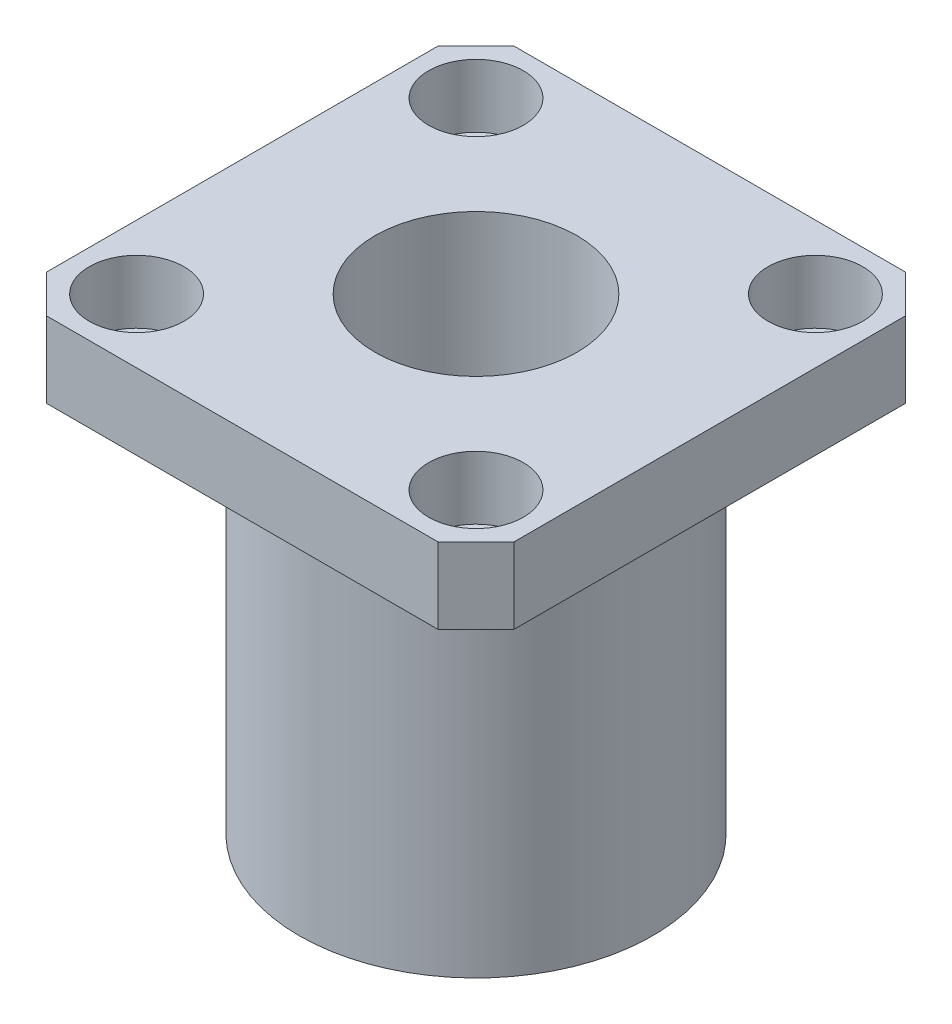
ISO-10303-21;
HEADER;
FILE_DESCRIPTION(('STEP AP214'),'2;1');
FILE_NAME('part.step','',(''),(''),'','','');
FILE_SCHEMA(('AUTOMOTIVE_DESIGN { 1 0 10303 214 1 1 1 1 }'));
ENDSEC;
DATA;
#1=APPLICATION_CONTEXT('core data for automotive mechanical design processes');
#2=APPLICATION_PROTOCOL_DEFINITION('international standard','automotive_design',2000,#1);
#3=PRODUCT_CONTEXT('',#1,'mechanical');
#4=PRODUCT('Part','Part','',(#3));
#5=PRODUCT_RELATED_PRODUCT_CATEGORY('part','',(#4));
#6=PRODUCT_DEFINITION_FORMATION('','',#4);
#7=PRODUCT_DEFINITION_CONTEXT('part definition',#1,'design');
#8=PRODUCT_DEFINITION('design','',#6,#7);
#9=PRODUCT_DEFINITION_SHAPE('','',#8);
#10=(LENGTH_UNIT() NAMED_UNIT(*) SI_UNIT(.MILLI.,.METRE.));
#11=(NAMED_UNIT(*) PLANE_ANGLE_UNIT() SI_UNIT($,.RADIAN.));
#12=(NAMED_UNIT(*) SI_UNIT($,.STERADIAN.) SOLID_ANGLE_UNIT());
#13=UNCERTAINTY_MEASURE_WITH_UNIT(LENGTH_MEASURE(1.E-05),#10,'distance_accuracy_value','');
#14=(GEOMETRIC_REPRESENTATION_CONTEXT(3) GLOBAL_UNCERTAINTY_ASSIGNED_CONTEXT((#13)) GLOBAL_UNIT_ASSIGNED_CONTEXT((#10,
#11,#12)) REPRESENTATION_CONTEXT('',''));
#15=CARTESIAN_POINT('',(0.,0.,0.));
#16=DIRECTION('',(0.,0.,1.));
#17=DIRECTION('',(1.,0.,0.));
#18=AXIS2_PLACEMENT_3D('',#15,#16,#17);
#19=CARTESIAN_POINT('',(0.,37.,0.));
#20=DIRECTION('',(0.,-1.,0.));
#21=DIRECTION('',(0.,0.,-1.));
#22=AXIS2_PLACEMENT_3D('',#19,#20,#21);
#23=CYLINDRICAL_SURFACE('',#22,14.);
#24=CARTESIAN_POINT('',(0.,0.,0.));
#25=DIRECTION('',(0.,1.,0.));
#26=DIRECTION('',(0.,0.,1.));
#27=AXIS2_PLACEMENT_3D('',#24,#25,#26);
#28=CIRCLE('',#27,14.);
#29=CARTESIAN_POINT('',(0.,0.,14.));
#30=VERTEX_POINT('',#29);
#31=EDGE_CURVE('E123',#30,#30,#28,.T.);
#32=ORIENTED_EDGE('',*,*,#31,.T.);
#33=EDGE_LOOP('',(#32));
#34=FACE_BOUND('',#33,.T.);
#35=CARTESIAN_POINT('',(0.,31.,0.));
#36=DIRECTION('',(0.,1.,0.));
#37=DIRECTION('',(0.,0.,1.));
#38=AXIS2_PLACEMENT_3D('',#35,#36,#37);
#39=CIRCLE('',#38,14.);
#40=CARTESIAN_POINT('',(0.,31.,14.));
#41=VERTEX_POINT('',#40);
#42=EDGE_CURVE('E119',#41,#41,#39,.T.);
#43=ORIENTED_EDGE('',*,*,#42,.F.);
#44=EDGE_LOOP('',(#43));
#45=FACE_BOUND('',#44,.T.);
#46=ADVANCED_FACE('F34',(#34,#45),#23,.T.);
#47=CARTESIAN_POINT('',(0.,37.,0.));
#48=DIRECTION('',(0.,1.,0.));
#49=DIRECTION('',(0.,0.,1.));
#50=AXIS2_PLACEMENT_3D('',#47,#48,#49);
#51=PLANE('',#50);
#52=CARTESIAN_POINT('',(13.4350288425444,37.,13.4350288425444));
#53=DIRECTION('',(0.,1.,0.));
#54=DIRECTION('',(0.,0.,1.));
#55=AXIS2_PLACEMENT_3D('',#52,#53,#54);
#56=CIRCLE('',#55,3.75);
#57=CARTESIAN_POINT('',(13.4350288425444,37.,17.1850288425444));
#58=VERTEX_POINT('',#57);
#59=EDGE_CURVE('E302',#58,#58,#56,.T.);
#60=ORIENTED_EDGE('',*,*,#59,.F.);
#61=EDGE_LOOP('',(#60));
#62=FACE_BOUND('',#61,.T.);
#63=CARTESIAN_POINT('',(-13.4350288425444,37.,13.4350288425444));
#64=DIRECTION('',(0.,1.,0.));
#65=DIRECTION('',(0.,0.,1.));
#66=AXIS2_PLACEMENT_3D('',#63,#64,#65);
#67=CIRCLE('',#66,3.75);
#68=CARTESIAN_POINT('',(-13.4350288425444,37.,17.1850288425444));
#69=VERTEX_POINT('',#68);
#70=EDGE_CURVE('E312',#69,#69,#67,.T.);
#71=ORIENTED_EDGE('',*,*,#70,.F.);
#72=EDGE_LOOP('',(#71));
#73=FACE_BOUND('',#72,.T.);
#74=CARTESIAN_POINT('',(-13.4350288425444,37.,-13.4350288425444));
#75=DIRECTION('',(0.,1.,0.));
#76=DIRECTION('',(0.,0.,1.));
#77=AXIS2_PLACEMENT_3D('',#74,#75,#76);
#78=CIRCLE('',#77,3.75);
#79=CARTESIAN_POINT('',(-13.4350288425444,37.,-9.6850288425444));
#80=VERTEX_POINT('',#79);
#81=EDGE_CURVE('E324',#80,#80,#78,.T.);
#82=ORIENTED_EDGE('',*,*,#81,.F.);
#83=EDGE_LOOP('',(#82));
#84=FACE_BOUND('',#83,.T.);
#85=CARTESIAN_POINT('',(13.4350288425444,37.,-13.4350288425444));
#86=DIRECTION('',(0.,1.,0.));
#87=DIRECTION('',(0.,0.,1.));
#88=AXIS2_PLACEMENT_3D('',#85,#86,#87);
#89=CIRCLE('',#88,3.75);
#90=CARTESIAN_POINT('',(13.4350288425444,37.,-9.6850288425444));
#91=VERTEX_POINT('',#90);
#92=EDGE_CURVE('E336',#91,#91,#89,.T.);
#93=ORIENTED_EDGE('',*,*,#92,.F.);
#94=EDGE_LOOP('',(#93));
#95=FACE_BOUND('',#94,.T.);
#96=CARTESIAN_POINT('',(0.,37.,0.));
#97=DIRECTION('',(0.,1.,0.));
#98=DIRECTION('',(0.,0.,1.));
#99=AXIS2_PLACEMENT_3D('',#96,#97,#98);
#100=CIRCLE('',#99,8.);
#101=CARTESIAN_POINT('',(0.,37.,8.));
#102=VERTEX_POINT('',#101);
#103=EDGE_CURVE('E171',#102,#102,#100,.T.);
#104=ORIENTED_EDGE('',*,*,#103,.F.);
#105=EDGE_LOOP('',(#104));
#106=FACE_BOUND('',#105,.T.);
#107=DIRECTION('',(0.,0.,-1.));
#108=VECTOR('',#107,1.);
#109=CARTESIAN_POINT('',(18.5,37.,18.5));
#110=LINE('',#109,#108);
#111=CARTESIAN_POINT('',(18.5,37.,15.5));
#112=VERTEX_POINT('',#111);
#113=CARTESIAN_POINT('',(18.5,37.,-15.5));
#114=VERTEX_POINT('',#113);
#115=EDGE_CURVE('E102',#112,#114,#110,.T.);
#116=ORIENTED_EDGE('',*,*,#115,.T.);
#117=DIRECTION('',(0.707106781186548,0.,0.707106781186547));
#118=VECTOR('',#117,1.);
#119=CARTESIAN_POINT('',(17.,37.,-17.));
#120=LINE('',#119,#118);
#121=CARTESIAN_POINT('',(15.5,37.,-18.5));
#122=VERTEX_POINT('',#121);
#123=EDGE_CURVE('E131',#114,#122,#120,.F.);
#124=ORIENTED_EDGE('',*,*,#123,.T.);
#125=DIRECTION('',(-1.,0.,0.));
#126=VECTOR('',#125,1.);
#127=CARTESIAN_POINT('',(18.5,37.,-18.5));
#128=LINE('',#127,#126);
#129=CARTESIAN_POINT('',(-15.5,37.,-18.5));
#130=VERTEX_POINT('',#129);
#131=EDGE_CURVE('E117',#122,#130,#128,.T.);
#132=ORIENTED_EDGE('',*,*,#131,.T.);
#133=DIRECTION('',(0.707106781186548,0.,-0.707106781186548));
#134=VECTOR('',#133,1.);
#135=CARTESIAN_POINT('',(-17.,37.,-17.));
#136=LINE('',#135,#134);
#137=CARTESIAN_POINT('',(-18.5,37.,-15.5));
#138=VERTEX_POINT('',#137);
#139=EDGE_CURVE('E129',#130,#138,#136,.F.);
#140=ORIENTED_EDGE('',*,*,#139,.T.);
#141=DIRECTION('',(0.,0.,1.));
#142=VECTOR('',#141,1.);
#143=CARTESIAN_POINT('',(-18.5,37.,18.5));
#144=LINE('',#143,#142);
#145=CARTESIAN_POINT('',(-18.5,37.,15.5));
#146=VERTEX_POINT('',#145);
#147=EDGE_CURVE('E164',#138,#146,#144,.T.);
#148=ORIENTED_EDGE('',*,*,#147,.T.);
#149=DIRECTION('',(-0.707106781186548,0.,-0.707106781186547));
#150=VECTOR('',#149,1.);
#151=CARTESIAN_POINT('',(-17.,37.,17.));
#152=LINE('',#151,#150);
#153=CARTESIAN_POINT('',(-15.5,37.,18.5));
#154=VERTEX_POINT('',#153);
#155=EDGE_CURVE('E108',#146,#154,#152,.F.);
#156=ORIENTED_EDGE('',*,*,#155,.T.);
#157=DIRECTION('',(1.,0.,0.));
#158=VECTOR('',#157,1.);
#159=CARTESIAN_POINT('',(18.5,37.,18.5));
#160=LINE('',#159,#158);
#161=CARTESIAN_POINT('',(15.5,37.,18.5));
#162=VERTEX_POINT('',#161);
#163=EDGE_CURVE('E103',#154,#162,#160,.T.);
#164=ORIENTED_EDGE('',*,*,#163,.T.);
#165=DIRECTION('',(-0.707106781186547,0.,0.707106781186548));
#166=VECTOR('',#165,1.);
#167=CARTESIAN_POINT('',(17.,37.,17.));
#168=LINE('',#167,#166);
#169=EDGE_CURVE('E99',#162,#112,#168,.F.);
#170=ORIENTED_EDGE('',*,*,#169,.T.);
#171=EDGE_LOOP('',(#116,#124,#132,#140,#148,#156,#164,#170));
#172=FACE_BOUND('',#171,.T.);
#173=ADVANCED_FACE('F101',(#62,#73,#84,#95,#106,#172),#51,.T.);
#174=CARTESIAN_POINT('',(0.,0.,0.));
#175=DIRECTION('',(0.,1.,0.));
#176=DIRECTION('',(0.,0.,1.));
#177=AXIS2_PLACEMENT_3D('',#174,#175,#176);
#178=PLANE('',#177);
#179=ORIENTED_EDGE('',*,*,#31,.F.);
#180=EDGE_LOOP('',(#179));
#181=FACE_BOUND('',#180,.T.);
#182=CARTESIAN_POINT('',(0.,0.,0.));
#183=DIRECTION('',(0.,1.,0.));
#184=DIRECTION('',(0.,0.,1.));
#185=AXIS2_PLACEMENT_3D('',#182,#183,#184);
#186=CIRCLE('',#185,8.);
#187=CARTESIAN_POINT('',(0.,0.,8.));
#188=VERTEX_POINT('',#187);
#189=EDGE_CURVE('E163',#188,#188,#186,.T.);
#190=ORIENTED_EDGE('',*,*,#189,.T.);
#191=EDGE_LOOP('',(#190));
#192=FACE_BOUND('',#191,.T.);
#193=ADVANCED_FACE('F176',(#181,#192),#178,.F.);
#194=CARTESIAN_POINT('',(0.,37.,0.));
#195=DIRECTION('',(0.,-1.,0.));
#196=DIRECTION('',(0.,0.,-1.));
#197=AXIS2_PLACEMENT_3D('',#194,#195,#196);
#198=CYLINDRICAL_SURFACE('',#197,8.);
#199=ORIENTED_EDGE('',*,*,#103,.T.);
#200=EDGE_LOOP('',(#199));
#201=FACE_BOUND('',#200,.T.);
#202=ORIENTED_EDGE('',*,*,#189,.F.);
#203=EDGE_LOOP('',(#202));
#204=FACE_BOUND('',#203,.T.);
#205=ADVANCED_FACE('F178',(#201,#204),#198,.F.);
#206=CARTESIAN_POINT('',(0.,31.,0.));
#207=DIRECTION('',(0.,1.,0.));
#208=DIRECTION('',(0.,0.,1.));
#209=AXIS2_PLACEMENT_3D('',#206,#207,#208);
#210=PLANE('',#209);
#211=CARTESIAN_POINT('',(13.4350288425444,31.,13.4350288425444));
#212=DIRECTION('',(0.,1.,0.));
#213=DIRECTION('',(0.,0.,1.));
#214=AXIS2_PLACEMENT_3D('',#211,#212,#213);
#215=CIRCLE('',#214,2.25);
#216=CARTESIAN_POINT('',(13.4350288425444,31.,15.6850288425444));
#217=VERTEX_POINT('',#216);
#218=EDGE_CURVE('E309',#217,#217,#215,.T.);
#219=ORIENTED_EDGE('',*,*,#218,.T.);
#220=EDGE_LOOP('',(#219));
#221=FACE_BOUND('',#220,.T.);
#222=CARTESIAN_POINT('',(-13.4350288425444,31.,13.4350288425444));
#223=DIRECTION('',(0.,1.,0.));
#224=DIRECTION('',(0.,0.,1.));
#225=AXIS2_PLACEMENT_3D('',#222,#223,#224);
#226=CIRCLE('',#225,2.25);
#227=CARTESIAN_POINT('',(-13.4350288425444,31.,15.6850288425444));
#228=VERTEX_POINT('',#227);
#229=EDGE_CURVE('E321',#228,#228,#226,.T.);
#230=ORIENTED_EDGE('',*,*,#229,.T.);
#231=EDGE_LOOP('',(#230));
#232=FACE_BOUND('',#231,.T.);
#233=CARTESIAN_POINT('',(-13.4350288425444,31.,-13.4350288425444));
#234=DIRECTION('',(0.,1.,0.));
#235=DIRECTION('',(0.,0.,1.));
#236=AXIS2_PLACEMENT_3D('',#233,#234,#235);
#237=CIRCLE('',#236,2.25);
#238=CARTESIAN_POINT('',(-13.4350288425444,31.,-11.1850288425444));
#239=VERTEX_POINT('',#238);
#240=EDGE_CURVE('E333',#239,#239,#237,.T.);
#241=ORIENTED_EDGE('',*,*,#240,.T.);
#242=EDGE_LOOP('',(#241));
#243=FACE_BOUND('',#242,.T.);
#244=CARTESIAN_POINT('',(13.4350288425444,31.,-13.4350288425444));
#245=DIRECTION('',(0.,1.,0.));
#246=DIRECTION('',(0.,0.,1.));
#247=AXIS2_PLACEMENT_3D('',#244,#245,#246);
#248=CIRCLE('',#247,2.25);
#249=CARTESIAN_POINT('',(13.4350288425444,31.,-11.1850288425444));
#250=VERTEX_POINT('',#249);
#251=EDGE_CURVE('E167',#250,#250,#248,.T.);
#252=ORIENTED_EDGE('',*,*,#251,.T.);
#253=EDGE_LOOP('',(#252));
#254=FACE_BOUND('',#253,.T.);
#255=DIRECTION('',(-1.,0.,0.));
#256=VECTOR('',#255,1.);
#257=CARTESIAN_POINT('',(18.5,31.,-18.5));
#258=LINE('',#257,#256);
#259=CARTESIAN_POINT('',(15.5,31.,-18.5));
#260=VERTEX_POINT('',#259);
#261=CARTESIAN_POINT('',(-15.5,31.,-18.5));
#262=VERTEX_POINT('',#261);
#263=EDGE_CURVE('E155',#260,#262,#258,.T.);
#264=ORIENTED_EDGE('',*,*,#263,.F.);
#265=DIRECTION('',(-0.707106781186548,0.,-0.707106781186547));
#266=VECTOR('',#265,1.);
#267=CARTESIAN_POINT('',(18.5,31.,-15.5));
#268=LINE('',#267,#266);
#269=CARTESIAN_POINT('',(18.5,31.,-15.5));
#270=VERTEX_POINT('',#269);
#271=EDGE_CURVE('E143',#260,#270,#268,.F.);
#272=ORIENTED_EDGE('',*,*,#271,.T.);
#273=DIRECTION('',(0.,0.,-1.));
#274=VECTOR('',#273,1.);
#275=CARTESIAN_POINT('',(18.5,31.,18.5));
#276=LINE('',#275,#274);
#277=CARTESIAN_POINT('',(18.5,31.,15.5));
#278=VERTEX_POINT('',#277);
#279=EDGE_CURVE('E152',#278,#270,#276,.T.);
#280=ORIENTED_EDGE('',*,*,#279,.F.);
#281=DIRECTION('',(0.707106781186547,0.,-0.707106781186548));
#282=VECTOR('',#281,1.);
#283=CARTESIAN_POINT('',(15.5,31.,18.5));
#284=LINE('',#283,#282);
#285=CARTESIAN_POINT('',(15.5,31.,18.5));
#286=VERTEX_POINT('',#285);
#287=EDGE_CURVE('E49',#278,#286,#284,.F.);
#288=ORIENTED_EDGE('',*,*,#287,.T.);
#289=DIRECTION('',(1.,0.,0.));
#290=VECTOR('',#289,1.);
#291=CARTESIAN_POINT('',(18.5,31.,18.5));
#292=LINE('',#291,#290);
#293=CARTESIAN_POINT('',(-15.5,31.,18.5));
#294=VERTEX_POINT('',#293);
#295=EDGE_CURVE('E150',#294,#286,#292,.T.);
#296=ORIENTED_EDGE('',*,*,#295,.F.);
#297=DIRECTION('',(0.707106781186548,0.,0.707106781186547));
#298=VECTOR('',#297,1.);
#299=CARTESIAN_POINT('',(-18.5,31.,15.5));
#300=LINE('',#299,#298);
#301=CARTESIAN_POINT('',(-18.5,31.,15.5));
#302=VERTEX_POINT('',#301);
#303=EDGE_CURVE('E139',#294,#302,#300,.F.);
#304=ORIENTED_EDGE('',*,*,#303,.T.);
#305=DIRECTION('',(0.,0.,1.));
#306=VECTOR('',#305,1.);
#307=CARTESIAN_POINT('',(-18.5,31.,18.5));
#308=LINE('',#307,#306);
#309=CARTESIAN_POINT('',(-18.5,31.,-15.5));
#310=VERTEX_POINT('',#309);
#311=EDGE_CURVE('E153',#310,#302,#308,.T.);
#312=ORIENTED_EDGE('',*,*,#311,.F.);
#313=DIRECTION('',(-0.707106781186548,0.,0.707106781186548));
#314=VECTOR('',#313,1.);
#315=CARTESIAN_POINT('',(-15.5,31.,-18.5));
#316=LINE('',#315,#314);
#317=EDGE_CURVE('E141',#310,#262,#316,.F.);
#318=ORIENTED_EDGE('',*,*,#317,.T.);
#319=EDGE_LOOP('',(#264,#272,#280,#288,#296,#304,#312,#318));
#320=FACE_BOUND('',#319,.T.);
#321=ORIENTED_EDGE('',*,*,#42,.T.);
#322=EDGE_LOOP('',(#321));
#323=FACE_BOUND('',#322,.T.);
#324=ADVANCED_FACE('F180',(#221,#232,#243,#254,#320,#323),#210,.F.);
#325=CARTESIAN_POINT('',(-18.5,31.,18.5));
#326=DIRECTION('',(-1.,0.,0.));
#327=DIRECTION('',(0.,0.,1.));
#328=AXIS2_PLACEMENT_3D('',#325,#326,#327);
#329=PLANE('',#328);
#330=ORIENTED_EDGE('',*,*,#147,.F.);
#331=DIRECTION('',(0.,-1.,0.));
#332=VECTOR('',#331,1.);
#333=CARTESIAN_POINT('',(-18.5,31.,-15.5));
#334=LINE('',#333,#332);
#335=EDGE_CURVE('E148',#138,#310,#334,.T.);
#336=ORIENTED_EDGE('',*,*,#335,.T.);
#337=ORIENTED_EDGE('',*,*,#311,.T.);
#338=DIRECTION('',(0.,1.,0.));
#339=VECTOR('',#338,1.);
#340=CARTESIAN_POINT('',(-18.5,31.,15.5));
#341=LINE('',#340,#339);
#342=EDGE_CURVE('E145',#302,#146,#341,.T.);
#343=ORIENTED_EDGE('',*,*,#342,.T.);
#344=EDGE_LOOP('',(#330,#336,#337,#343));
#345=FACE_BOUND('',#344,.T.);
#346=ADVANCED_FACE('F187',(#345),#329,.T.);
#347=CARTESIAN_POINT('',(18.5,31.,-18.5));
#348=DIRECTION('',(0.,0.,-1.));
#349=DIRECTION('',(-1.,0.,0.));
#350=AXIS2_PLACEMENT_3D('',#347,#348,#349);
#351=PLANE('',#350);
#352=ORIENTED_EDGE('',*,*,#131,.F.);
#353=DIRECTION('',(0.,-1.,0.));
#354=VECTOR('',#353,1.);
#355=CARTESIAN_POINT('',(15.5,31.,-18.5));
#356=LINE('',#355,#354);
#357=EDGE_CURVE('E136',#122,#260,#356,.T.);
#358=ORIENTED_EDGE('',*,*,#357,.T.);
#359=ORIENTED_EDGE('',*,*,#263,.T.);
#360=DIRECTION('',(0.,1.,0.));
#361=VECTOR('',#360,1.);
#362=CARTESIAN_POINT('',(-15.5,31.,-18.5));
#363=LINE('',#362,#361);
#364=EDGE_CURVE('E133',#262,#130,#363,.T.);
#365=ORIENTED_EDGE('',*,*,#364,.T.);
#366=EDGE_LOOP('',(#352,#358,#359,#365));
#367=FACE_BOUND('',#366,.T.);
#368=ADVANCED_FACE('F230',(#367),#351,.T.);
#369=CARTESIAN_POINT('',(18.5,31.,18.5));
#370=DIRECTION('',(1.,0.,0.));
#371=DIRECTION('',(0.,0.,-1.));
#372=AXIS2_PLACEMENT_3D('',#369,#370,#371);
#373=PLANE('',#372);
#374=ORIENTED_EDGE('',*,*,#279,.T.);
#375=DIRECTION('',(0.,1.,0.));
#376=VECTOR('',#375,1.);
#377=CARTESIAN_POINT('',(18.5,31.,-15.5));
#378=LINE('',#377,#376);
#379=EDGE_CURVE('E109',#270,#114,#378,.T.);
#380=ORIENTED_EDGE('',*,*,#379,.T.);
#381=ORIENTED_EDGE('',*,*,#115,.F.);
#382=DIRECTION('',(0.,-1.,0.));
#383=VECTOR('',#382,1.);
#384=CARTESIAN_POINT('',(18.5,31.,15.5));
#385=LINE('',#384,#383);
#386=EDGE_CURVE('E115',#112,#278,#385,.T.);
#387=ORIENTED_EDGE('',*,*,#386,.T.);
#388=EDGE_LOOP('',(#374,#380,#381,#387));
#389=FACE_BOUND('',#388,.T.);
#390=ADVANCED_FACE('F114',(#389),#373,.T.);
#391=CARTESIAN_POINT('',(18.5,31.,18.5));
#392=DIRECTION('',(0.,0.,1.));
#393=DIRECTION('',(1.,0.,0.));
#394=AXIS2_PLACEMENT_3D('',#391,#392,#393);
#395=PLANE('',#394);
#396=ORIENTED_EDGE('',*,*,#163,.F.);
#397=DIRECTION('',(0.,-1.,0.));
#398=VECTOR('',#397,1.);
#399=CARTESIAN_POINT('',(-15.5,31.,18.5));
#400=LINE('',#399,#398);
#401=EDGE_CURVE('E11',#154,#294,#400,.T.);
#402=ORIENTED_EDGE('',*,*,#401,.T.);
#403=ORIENTED_EDGE('',*,*,#295,.T.);
#404=DIRECTION('',(0.,1.,0.));
#405=VECTOR('',#404,1.);
#406=CARTESIAN_POINT('',(15.5,31.,18.5));
#407=LINE('',#406,#405);
#408=EDGE_CURVE('E42',#286,#162,#407,.T.);
#409=ORIENTED_EDGE('',*,*,#408,.T.);
#410=EDGE_LOOP('',(#396,#402,#403,#409));
#411=FACE_BOUND('',#410,.T.);
#412=ADVANCED_FACE('F149',(#411),#395,.T.);
#413=CARTESIAN_POINT('',(13.4350288425444,37.,-13.4350288425444));
#414=DIRECTION('',(0.,1.,0.));
#415=DIRECTION('',(0.,0.,1.));
#416=AXIS2_PLACEMENT_3D('',#413,#414,#415);
#417=CYLINDRICAL_SURFACE('',#416,2.25);
#418=ORIENTED_EDGE('',*,*,#251,.F.);
#419=EDGE_LOOP('',(#418));
#420=FACE_BOUND('',#419,.T.);
#421=CARTESIAN_POINT('',(13.4350288425444,32.,-13.4350288425444));
#422=DIRECTION('',(0.,1.,0.));
#423=DIRECTION('',(0.,0.,1.));
#424=AXIS2_PLACEMENT_3D('',#421,#422,#423);
#425=CIRCLE('',#424,2.25);
#426=CARTESIAN_POINT('',(13.4350288425444,32.,-11.1850288425444));
#427=VERTEX_POINT('',#426);
#428=EDGE_CURVE('E342',#427,#427,#425,.T.);
#429=ORIENTED_EDGE('',*,*,#428,.T.);
#430=EDGE_LOOP('',(#429));
#431=FACE_BOUND('',#430,.T.);
#432=ADVANCED_FACE('F242',(#420,#431),#417,.F.);
#433=CARTESIAN_POINT('',(15.6850288425444,32.,-13.4350288425444));
#434=DIRECTION('',(0.,-1.,0.));
#435=DIRECTION('',(0.,0.,-1.));
#436=AXIS2_PLACEMENT_3D('',#433,#434,#435);
#437=PLANE('',#436);
#438=ORIENTED_EDGE('',*,*,#428,.F.);
#439=EDGE_LOOP('',(#438));
#440=FACE_BOUND('',#439,.T.);
#441=CARTESIAN_POINT('',(13.4350288425444,32.,-13.4350288425444));
#442=DIRECTION('',(0.,1.,0.));
#443=DIRECTION('',(0.,0.,1.));
#444=AXIS2_PLACEMENT_3D('',#441,#442,#443);
#445=CIRCLE('',#444,3.75);
#446=CARTESIAN_POINT('',(13.4350288425444,32.,-9.6850288425444));
#447=VERTEX_POINT('',#446);
#448=EDGE_CURVE('E339',#447,#447,#445,.T.);
#449=ORIENTED_EDGE('',*,*,#448,.T.);
#450=EDGE_LOOP('',(#449));
#451=FACE_BOUND('',#450,.T.);
#452=ADVANCED_FACE('F246',(#440,#451),#437,.F.);
#453=CARTESIAN_POINT('',(13.4350288425444,37.,-13.4350288425444));
#454=DIRECTION('',(0.,1.,0.));
#455=DIRECTION('',(0.,0.,1.));
#456=AXIS2_PLACEMENT_3D('',#453,#454,#455);
#457=CYLINDRICAL_SURFACE('',#456,3.75);
#458=ORIENTED_EDGE('',*,*,#448,.F.);
#459=EDGE_LOOP('',(#458));
#460=FACE_BOUND('',#459,.T.);
#461=ORIENTED_EDGE('',*,*,#92,.T.);
#462=EDGE_LOOP('',(#461));
#463=FACE_BOUND('',#462,.T.);
#464=ADVANCED_FACE('F251',(#460,#463),#457,.F.);
#465=CARTESIAN_POINT('',(-13.4350288425444,37.,-13.4350288425444));
#466=DIRECTION('',(0.,1.,0.));
#467=DIRECTION('',(0.,0.,1.));
#468=AXIS2_PLACEMENT_3D('',#465,#466,#467);
#469=CYLINDRICAL_SURFACE('',#468,2.25);
#470=ORIENTED_EDGE('',*,*,#240,.F.);
#471=EDGE_LOOP('',(#470));
#472=FACE_BOUND('',#471,.T.);
#473=CARTESIAN_POINT('',(-13.4350288425444,32.,-13.4350288425444));
#474=DIRECTION('',(0.,1.,0.));
#475=DIRECTION('',(0.,0.,1.));
#476=AXIS2_PLACEMENT_3D('',#473,#474,#475);
#477=CIRCLE('',#476,2.25);
#478=CARTESIAN_POINT('',(-13.4350288425444,32.,-11.1850288425444));
#479=VERTEX_POINT('',#478);
#480=EDGE_CURVE('E330',#479,#479,#477,.T.);
#481=ORIENTED_EDGE('',*,*,#480,.T.);
#482=EDGE_LOOP('',(#481));
#483=FACE_BOUND('',#482,.T.);
#484=ADVANCED_FACE('F259',(#472,#483),#469,.F.);
#485=CARTESIAN_POINT('',(-11.1850288425444,32.,-13.4350288425444));
#486=DIRECTION('',(0.,-1.,0.));
#487=DIRECTION('',(0.,0.,-1.));
#488=AXIS2_PLACEMENT_3D('',#485,#486,#487);
#489=PLANE('',#488);
#490=ORIENTED_EDGE('',*,*,#480,.F.);
#491=EDGE_LOOP('',(#490));
#492=FACE_BOUND('',#491,.T.);
#493=CARTESIAN_POINT('',(-13.4350288425444,32.,-13.4350288425444));
#494=DIRECTION('',(0.,1.,0.));
#495=DIRECTION('',(0.,0.,1.));
#496=AXIS2_PLACEMENT_3D('',#493,#494,#495);
#497=CIRCLE('',#496,3.75);
#498=CARTESIAN_POINT('',(-13.4350288425444,32.,-9.6850288425444));
#499=VERTEX_POINT('',#498);
#500=EDGE_CURVE('E327',#499,#499,#497,.T.);
#501=ORIENTED_EDGE('',*,*,#500,.T.);
#502=EDGE_LOOP('',(#501));
#503=FACE_BOUND('',#502,.T.);
#504=ADVANCED_FACE('F263',(#492,#503),#489,.F.);
#505=CARTESIAN_POINT('',(-13.4350288425444,37.,-13.4350288425444));
#506=DIRECTION('',(0.,1.,0.));
#507=DIRECTION('',(0.,0.,1.));
#508=AXIS2_PLACEMENT_3D('',#505,#506,#507);
#509=CYLINDRICAL_SURFACE('',#508,3.75);
#510=ORIENTED_EDGE('',*,*,#500,.F.);
#511=EDGE_LOOP('',(#510));
#512=FACE_BOUND('',#511,.T.);
#513=ORIENTED_EDGE('',*,*,#81,.T.);
#514=EDGE_LOOP('',(#513));
#515=FACE_BOUND('',#514,.T.);
#516=ADVANCED_FACE('F267',(#512,#515),#509,.F.);
#517=CARTESIAN_POINT('',(-13.4350288425444,37.,13.4350288425444));
#518=DIRECTION('',(0.,1.,0.));
#519=DIRECTION('',(0.,0.,1.));
#520=AXIS2_PLACEMENT_3D('',#517,#518,#519);
#521=CYLINDRICAL_SURFACE('',#520,2.25);
#522=ORIENTED_EDGE('',*,*,#229,.F.);
#523=EDGE_LOOP('',(#522));
#524=FACE_BOUND('',#523,.T.);
#525=CARTESIAN_POINT('',(-13.4350288425444,32.,13.4350288425444));
#526=DIRECTION('',(0.,1.,0.));
#527=DIRECTION('',(0.,0.,1.));
#528=AXIS2_PLACEMENT_3D('',#525,#526,#527);
#529=CIRCLE('',#528,2.25);
#530=CARTESIAN_POINT('',(-13.4350288425444,32.,15.6850288425444));
#531=VERTEX_POINT('',#530);
#532=EDGE_CURVE('E318',#531,#531,#529,.T.);
#533=ORIENTED_EDGE('',*,*,#532,.T.);
#534=EDGE_LOOP('',(#533));
#535=FACE_BOUND('',#534,.T.);
#536=ADVANCED_FACE('F271',(#524,#535),#521,.F.);
#537=CARTESIAN_POINT('',(-11.1850288425444,32.,13.4350288425444));
#538=DIRECTION('',(0.,-1.,0.));
#539=DIRECTION('',(0.,0.,-1.));
#540=AXIS2_PLACEMENT_3D('',#537,#538,#539);
#541=PLANE('',#540);
#542=ORIENTED_EDGE('',*,*,#532,.F.);
#543=EDGE_LOOP('',(#542));
#544=FACE_BOUND('',#543,.T.);
#545=CARTESIAN_POINT('',(-13.4350288425444,32.,13.4350288425444));
#546=DIRECTION('',(0.,1.,0.));
#547=DIRECTION('',(0.,0.,1.));
#548=AXIS2_PLACEMENT_3D('',#545,#546,#547);
#549=CIRCLE('',#548,3.75);
#550=CARTESIAN_POINT('',(-13.4350288425444,32.,17.1850288425444));
#551=VERTEX_POINT('',#550);
#552=EDGE_CURVE('E315',#551,#551,#549,.T.);
#553=ORIENTED_EDGE('',*,*,#552,.T.);
#554=EDGE_LOOP('',(#553));
#555=FACE_BOUND('',#554,.T.);
#556=ADVANCED_FACE('F275',(#544,#555),#541,.F.);
#557=CARTESIAN_POINT('',(-13.4350288425444,37.,13.4350288425444));
#558=DIRECTION('',(0.,1.,0.));
#559=DIRECTION('',(0.,0.,1.));
#560=AXIS2_PLACEMENT_3D('',#557,#558,#559);
#561=CYLINDRICAL_SURFACE('',#560,3.75);
#562=ORIENTED_EDGE('',*,*,#552,.F.);
#563=EDGE_LOOP('',(#562));
#564=FACE_BOUND('',#563,.T.);
#565=ORIENTED_EDGE('',*,*,#70,.T.);
#566=EDGE_LOOP('',(#565));
#567=FACE_BOUND('',#566,.T.);
#568=ADVANCED_FACE('F279',(#564,#567),#561,.F.);
#569=CARTESIAN_POINT('',(13.4350288425444,37.,13.4350288425444));
#570=DIRECTION('',(0.,1.,0.));
#571=DIRECTION('',(0.,0.,1.));
#572=AXIS2_PLACEMENT_3D('',#569,#570,#571);
#573=CYLINDRICAL_SURFACE('',#572,2.25);
#574=ORIENTED_EDGE('',*,*,#218,.F.);
#575=EDGE_LOOP('',(#574));
#576=FACE_BOUND('',#575,.T.);
#577=CARTESIAN_POINT('',(13.4350288425444,32.,13.4350288425444));
#578=DIRECTION('',(0.,1.,0.));
#579=DIRECTION('',(0.,0.,1.));
#580=AXIS2_PLACEMENT_3D('',#577,#578,#579);
#581=CIRCLE('',#580,2.25);
#582=CARTESIAN_POINT('',(13.4350288425444,32.,15.6850288425444));
#583=VERTEX_POINT('',#582);
#584=EDGE_CURVE('E304',#583,#583,#581,.T.);
#585=ORIENTED_EDGE('',*,*,#584,.T.);
#586=EDGE_LOOP('',(#585));
#587=FACE_BOUND('',#586,.T.);
#588=ADVANCED_FACE('F283',(#576,#587),#573,.F.);
#589=CARTESIAN_POINT('',(15.6850288425444,32.,13.4350288425444));
#590=DIRECTION('',(0.,-1.,0.));
#591=DIRECTION('',(0.,0.,-1.));
#592=AXIS2_PLACEMENT_3D('',#589,#590,#591);
#593=PLANE('',#592);
#594=ORIENTED_EDGE('',*,*,#584,.F.);
#595=EDGE_LOOP('',(#594));
#596=FACE_BOUND('',#595,.T.);
#597=CARTESIAN_POINT('',(13.4350288425444,32.,13.4350288425444));
#598=DIRECTION('',(0.,1.,0.));
#599=DIRECTION('',(0.,0.,1.));
#600=AXIS2_PLACEMENT_3D('',#597,#598,#599);
#601=CIRCLE('',#600,3.75);
#602=CARTESIAN_POINT('',(13.4350288425444,32.,17.1850288425444));
#603=VERTEX_POINT('',#602);
#604=EDGE_CURVE('E299',#603,#603,#601,.T.);
#605=ORIENTED_EDGE('',*,*,#604,.T.);
#606=EDGE_LOOP('',(#605));
#607=FACE_BOUND('',#606,.T.);
#608=ADVANCED_FACE('F287',(#596,#607),#593,.F.);
#609=CARTESIAN_POINT('',(13.4350288425444,37.,13.4350288425444));
#610=DIRECTION('',(0.,1.,0.));
#611=DIRECTION('',(0.,0.,1.));
#612=AXIS2_PLACEMENT_3D('',#609,#610,#611);
#613=CYLINDRICAL_SURFACE('',#612,3.75);
#614=ORIENTED_EDGE('',*,*,#604,.F.);
#615=EDGE_LOOP('',(#614));
#616=FACE_BOUND('',#615,.T.);
#617=ORIENTED_EDGE('',*,*,#59,.T.);
#618=EDGE_LOOP('',(#617));
#619=FACE_BOUND('',#618,.T.);
#620=ADVANCED_FACE('F208',(#616,#619),#613,.F.);
#621=CARTESIAN_POINT('',(18.5,31.,-15.5));
#622=DIRECTION('',(-0.707106781186547,0.,0.707106781186548));
#623=DIRECTION('',(0.,1.,0.));
#624=AXIS2_PLACEMENT_3D('',#621,#622,#623);
#625=PLANE('',#624);
#626=ORIENTED_EDGE('',*,*,#271,.F.);
#627=ORIENTED_EDGE('',*,*,#357,.F.);
#628=ORIENTED_EDGE('',*,*,#123,.F.);
#629=ORIENTED_EDGE('',*,*,#379,.F.);
#630=EDGE_LOOP('',(#626,#627,#628,#629));
#631=FACE_BOUND('',#630,.T.);
#632=ADVANCED_FACE('F204',(#631),#625,.F.);
#633=CARTESIAN_POINT('',(-15.5,31.,-18.5));
#634=DIRECTION('',(0.707106781186547,0.,0.707106781186547));
#635=DIRECTION('',(0.,1.,0.));
#636=AXIS2_PLACEMENT_3D('',#633,#634,#635);
#637=PLANE('',#636);
#638=ORIENTED_EDGE('',*,*,#317,.F.);
#639=ORIENTED_EDGE('',*,*,#335,.F.);
#640=ORIENTED_EDGE('',*,*,#139,.F.);
#641=ORIENTED_EDGE('',*,*,#364,.F.);
#642=EDGE_LOOP('',(#638,#639,#640,#641));
#643=FACE_BOUND('',#642,.T.);
#644=ADVANCED_FACE('F207',(#643),#637,.F.);
#645=CARTESIAN_POINT('',(-18.5,31.,15.5));
#646=DIRECTION('',(0.707106781186547,0.,-0.707106781186548));
#647=DIRECTION('',(0.,1.,0.));
#648=AXIS2_PLACEMENT_3D('',#645,#646,#647);
#649=PLANE('',#648);
#650=ORIENTED_EDGE('',*,*,#303,.F.);
#651=ORIENTED_EDGE('',*,*,#401,.F.);
#652=ORIENTED_EDGE('',*,*,#155,.F.);
#653=ORIENTED_EDGE('',*,*,#342,.F.);
#654=EDGE_LOOP('',(#650,#651,#652,#653));
#655=FACE_BOUND('',#654,.T.);
#656=ADVANCED_FACE('F211',(#655),#649,.F.);
#657=CARTESIAN_POINT('',(15.5,31.,18.5));
#658=DIRECTION('',(-0.707106781186548,0.,-0.707106781186547));
#659=DIRECTION('',(0.,1.,0.));
#660=AXIS2_PLACEMENT_3D('',#657,#658,#659);
#661=PLANE('',#660);
#662=ORIENTED_EDGE('',*,*,#287,.F.);
#663=ORIENTED_EDGE('',*,*,#386,.F.);
#664=ORIENTED_EDGE('',*,*,#169,.F.);
#665=ORIENTED_EDGE('',*,*,#408,.F.);
#666=EDGE_LOOP('',(#662,#663,#664,#665));
#667=FACE_BOUND('',#666,.T.);
#668=ADVANCED_FACE('F36',(#667),#661,.F.);
#669=CLOSED_SHELL('',(#46,#173,#193,#205,#324,#346,#368,#390,#412,#432,#452,#464,#484,#504,#516,
#536,#556,#568,#588,#608,#620,#632,#644,#656,#668));
#670=MANIFOLD_SOLID_BREP('B2',#669);
#671=ADVANCED_BREP_SHAPE_REPRESENTATION('',(#18,#670),#14);
#672=SHAPE_DEFINITION_REPRESENTATION(#9,#671);
ENDSEC;
END-ISO-10303-21;
